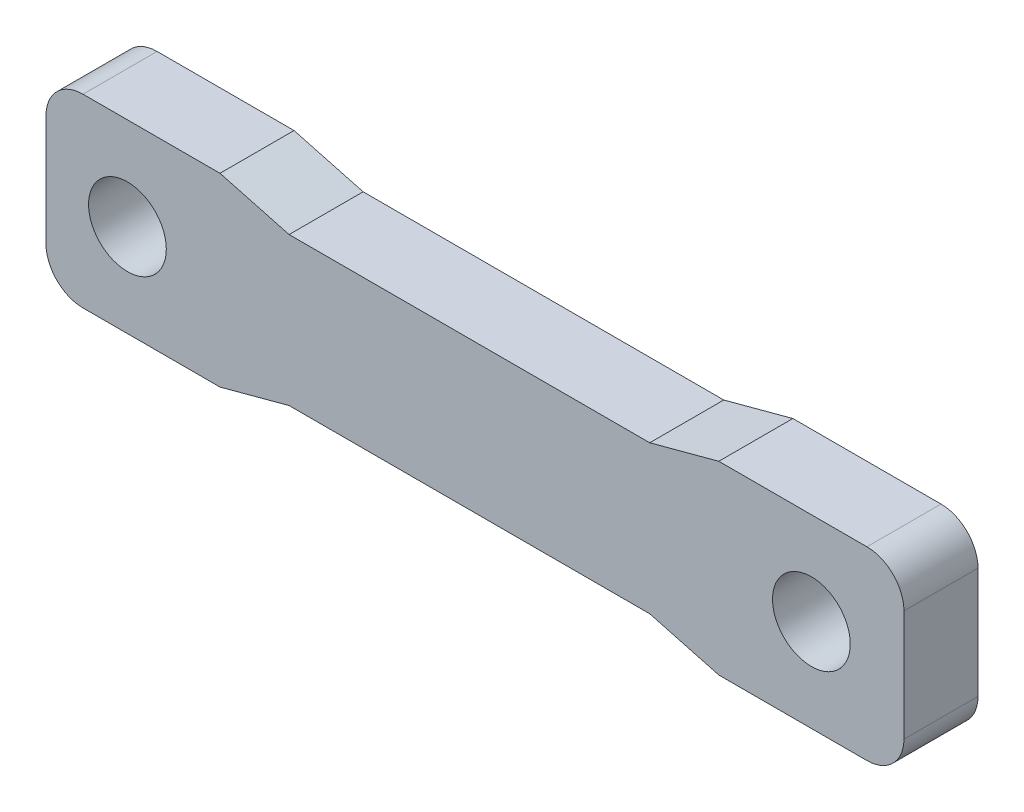
ISO-10303-21;
HEADER;
FILE_DESCRIPTION(('STEP AP214'),'2;1');
FILE_NAME('part.step','',(''),(''),'','','');
FILE_SCHEMA(('AUTOMOTIVE_DESIGN { 1 0 10303 214 1 1 1 1 }'));
ENDSEC;
DATA;
#1=APPLICATION_CONTEXT('core data for automotive mechanical design processes');
#2=APPLICATION_PROTOCOL_DEFINITION('international standard','automotive_design',2000,#1);
#3=PRODUCT_CONTEXT('',#1,'mechanical');
#4=PRODUCT('Part','Part','',(#3));
#5=PRODUCT_RELATED_PRODUCT_CATEGORY('part','',(#4));
#6=PRODUCT_DEFINITION_FORMATION('','',#4);
#7=PRODUCT_DEFINITION_CONTEXT('part definition',#1,'design');
#8=PRODUCT_DEFINITION('design','',#6,#7);
#9=PRODUCT_DEFINITION_SHAPE('','',#8);
#10=(LENGTH_UNIT() NAMED_UNIT(*) SI_UNIT(.MILLI.,.METRE.));
#11=(NAMED_UNIT(*) PLANE_ANGLE_UNIT() SI_UNIT($,.RADIAN.));
#12=(NAMED_UNIT(*) SI_UNIT($,.STERADIAN.) SOLID_ANGLE_UNIT());
#13=UNCERTAINTY_MEASURE_WITH_UNIT(LENGTH_MEASURE(1.E-05),#10,'distance_accuracy_value','');
#14=(GEOMETRIC_REPRESENTATION_CONTEXT(3) GLOBAL_UNCERTAINTY_ASSIGNED_CONTEXT((#13)) GLOBAL_UNIT_ASSIGNED_CONTEXT((#10,
#11,#12)) REPRESENTATION_CONTEXT('',''));
#15=CARTESIAN_POINT('',(0.,0.,0.));
#16=DIRECTION('',(0.,0.,1.));
#17=DIRECTION('',(1.,0.,0.));
#18=AXIS2_PLACEMENT_3D('',#15,#16,#17);
#19=CARTESIAN_POINT('',(-26.7785361810537,14.6,-4.5));
#20=DIRECTION('',(0.,0.,1.));
#21=DIRECTION('',(1.,0.,0.));
#22=AXIS2_PLACEMENT_3D('',#19,#20,#21);
#23=CYLINDRICAL_SURFACE('',#22,1.05);
#24=CARTESIAN_POINT('',(-26.7785361810537,14.6,0.));
#25=DIRECTION('',(0.,0.,1.));
#26=DIRECTION('',(1.,0.,0.));
#27=AXIS2_PLACEMENT_3D('',#24,#25,#26);
#28=CIRCLE('',#27,1.05);
#29=CARTESIAN_POINT('',(-25.7285361810537,14.6,0.));
#30=VERTEX_POINT('',#29);
#31=EDGE_CURVE('E383',#30,#30,#28,.F.);
#32=ORIENTED_EDGE('',*,*,#31,.T.);
#33=EDGE_LOOP('',(#32));
#34=FACE_BOUND('',#33,.T.);
#35=CARTESIAN_POINT('',(-26.7785361810537,14.6,2.));
#36=DIRECTION('',(0.,0.,1.));
#37=DIRECTION('',(1.,0.,0.));
#38=AXIS2_PLACEMENT_3D('',#35,#36,#37);
#39=CIRCLE('',#38,1.05);
#40=CARTESIAN_POINT('',(-25.7285361810537,14.6,2.));
#41=VERTEX_POINT('',#40);
#42=EDGE_CURVE('E322',#41,#41,#39,.T.);
#43=ORIENTED_EDGE('',*,*,#42,.T.);
#44=EDGE_LOOP('',(#43));
#45=FACE_BOUND('',#44,.T.);
#46=ADVANCED_FACE('F71',(#34,#45),#23,.F.);
#47=CARTESIAN_POINT('',(-53.25,12.1,-1.2));
#48=DIRECTION('',(0.,-1.,0.));
#49=DIRECTION('',(0.,0.,-1.));
#50=AXIS2_PLACEMENT_3D('',#47,#48,#49);
#51=PLANE('',#50);
#52=DIRECTION('',(1.,0.,0.));
#53=VECTOR('',#52,1.);
#54=CARTESIAN_POINT('',(-47.4492116240852,12.1,2.));
#55=LINE('',#54,#53);
#56=CARTESIAN_POINT('',(-46.4492116240852,12.1,2.));
#57=VERTEX_POINT('',#56);
#58=CARTESIAN_POINT('',(-42.75,12.1,2.));
#59=VERTEX_POINT('',#58);
#60=EDGE_CURVE('E391',#57,#59,#55,.T.);
#61=ORIENTED_EDGE('',*,*,#60,.F.);
#62=DIRECTION('',(0.,0.,-1.));
#63=VECTOR('',#62,1.);
#64=CARTESIAN_POINT('',(-46.4492116240852,12.1,0.));
#65=LINE('',#64,#63);
#66=CARTESIAN_POINT('',(-46.4492116240852,12.1,0.));
#67=VERTEX_POINT('',#66);
#68=EDGE_CURVE('E12',#57,#67,#65,.T.);
#69=ORIENTED_EDGE('',*,*,#68,.T.);
#70=DIRECTION('',(1.,0.,0.));
#71=VECTOR('',#70,1.);
#72=CARTESIAN_POINT('',(-47.4492116240852,12.1,0.));
#73=LINE('',#72,#71);
#74=CARTESIAN_POINT('',(-42.75,12.1,0.));
#75=VERTEX_POINT('',#74);
#76=EDGE_CURVE('E312',#67,#75,#73,.T.);
#77=ORIENTED_EDGE('',*,*,#76,.T.);
#78=DIRECTION('',(0.,0.,-1.));
#79=VECTOR('',#78,1.);
#80=CARTESIAN_POINT('',(-42.75,12.1,2.));
#81=LINE('',#80,#79);
#82=EDGE_CURVE('E240',#59,#75,#81,.T.);
#83=ORIENTED_EDGE('',*,*,#82,.F.);
#84=EDGE_LOOP('',(#61,#69,#77,#83));
#85=FACE_BOUND('',#84,.T.);
#86=ADVANCED_FACE('F417',(#85),#51,.T.);
#87=CARTESIAN_POINT('',(-53.25,17.1,-1.2));
#88=DIRECTION('',(0.,1.,0.));
#89=DIRECTION('',(0.,0.,1.));
#90=AXIS2_PLACEMENT_3D('',#87,#88,#89);
#91=PLANE('',#90);
#92=DIRECTION('',(1.,0.,0.));
#93=VECTOR('',#92,1.);
#94=CARTESIAN_POINT('',(-53.25,17.1,0.));
#95=LINE('',#94,#93);
#96=CARTESIAN_POINT('',(-46.4492116240852,17.1,0.));
#97=VERTEX_POINT('',#96);
#98=CARTESIAN_POINT('',(-42.75,17.1,0.));
#99=VERTEX_POINT('',#98);
#100=EDGE_CURVE('E194',#97,#99,#95,.T.);
#101=ORIENTED_EDGE('',*,*,#100,.F.);
#102=DIRECTION('',(0.,0.,-1.));
#103=VECTOR('',#102,1.);
#104=CARTESIAN_POINT('',(-46.4492116240852,17.1,2.));
#105=LINE('',#104,#103);
#106=CARTESIAN_POINT('',(-46.4492116240852,17.1,2.));
#107=VERTEX_POINT('',#106);
#108=EDGE_CURVE('E80',#97,#107,#105,.F.);
#109=ORIENTED_EDGE('',*,*,#108,.T.);
#110=DIRECTION('',(-1.,0.,0.));
#111=VECTOR('',#110,1.);
#112=CARTESIAN_POINT('',(-42.75,17.1,2.));
#113=LINE('',#112,#111);
#114=CARTESIAN_POINT('',(-42.75,17.1,2.));
#115=VERTEX_POINT('',#114);
#116=EDGE_CURVE('E200',#115,#107,#113,.T.);
#117=ORIENTED_EDGE('',*,*,#116,.F.);
#118=DIRECTION('',(0.,0.,-1.));
#119=VECTOR('',#118,1.);
#120=CARTESIAN_POINT('',(-42.75,17.1,2.));
#121=LINE('',#120,#119);
#122=EDGE_CURVE('E217',#115,#99,#121,.T.);
#123=ORIENTED_EDGE('',*,*,#122,.T.);
#124=EDGE_LOOP('',(#101,#109,#117,#123));
#125=FACE_BOUND('',#124,.T.);
#126=ADVANCED_FACE('F292',(#125),#91,.T.);
#127=CARTESIAN_POINT('',(-25.8038756778899,12.1,-3.));
#128=DIRECTION('',(0.,1.,0.));
#129=DIRECTION('',(0.,0.,1.));
#130=AXIS2_PLACEMENT_3D('',#127,#128,#129);
#131=PLANE('',#130);
#132=DIRECTION('',(1.,0.,0.));
#133=VECTOR('',#132,1.);
#134=CARTESIAN_POINT('',(-29.2785361810537,12.1,0.));
#135=LINE('',#134,#133);
#136=CARTESIAN_POINT('',(-29.2785361810537,12.1,0.));
#137=VERTEX_POINT('',#136);
#138=CARTESIAN_POINT('',(-25.2785361810537,12.1,0.));
#139=VERTEX_POINT('',#138);
#140=EDGE_CURVE('E338',#137,#139,#135,.T.);
#141=ORIENTED_EDGE('',*,*,#140,.T.);
#142=DIRECTION('',(0.,0.,-1.));
#143=VECTOR('',#142,1.);
#144=CARTESIAN_POINT('',(-25.2785361810537,12.1,-3.));
#145=LINE('',#144,#143);
#146=CARTESIAN_POINT('',(-25.2785361810537,12.1,2.));
#147=VERTEX_POINT('',#146);
#148=EDGE_CURVE('E263',#139,#147,#145,.F.);
#149=ORIENTED_EDGE('',*,*,#148,.T.);
#150=DIRECTION('',(1.,0.,0.));
#151=VECTOR('',#150,1.);
#152=CARTESIAN_POINT('',(-29.2785361810537,12.1,2.));
#153=LINE('',#152,#151);
#154=CARTESIAN_POINT('',(-29.2785361810537,12.1,2.));
#155=VERTEX_POINT('',#154);
#156=EDGE_CURVE('E369',#155,#147,#153,.T.);
#157=ORIENTED_EDGE('',*,*,#156,.F.);
#158=DIRECTION('',(0.,0.,-1.));
#159=VECTOR('',#158,1.);
#160=CARTESIAN_POINT('',(-29.2785361810537,12.1,2.));
#161=LINE('',#160,#159);
#162=EDGE_CURVE('E229',#155,#137,#161,.T.);
#163=ORIENTED_EDGE('',*,*,#162,.T.);
#164=EDGE_LOOP('',(#141,#149,#157,#163));
#165=FACE_BOUND('',#164,.T.);
#166=ADVANCED_FACE('F406',(#165),#131,.F.);
#167=CARTESIAN_POINT('',(-45.25,14.6,-4.5));
#168=DIRECTION('',(0.,0.,1.));
#169=DIRECTION('',(1.,0.,0.));
#170=AXIS2_PLACEMENT_3D('',#167,#168,#169);
#171=CYLINDRICAL_SURFACE('',#170,1.05);
#172=CARTESIAN_POINT('',(-45.25,14.6,0.));
#173=DIRECTION('',(0.,0.,1.));
#174=DIRECTION('',(1.,0.,0.));
#175=AXIS2_PLACEMENT_3D('',#172,#173,#174);
#176=CIRCLE('',#175,1.05);
#177=CARTESIAN_POINT('',(-44.2,14.6,0.));
#178=VERTEX_POINT('',#177);
#179=EDGE_CURVE('E425',#178,#178,#176,.F.);
#180=ORIENTED_EDGE('',*,*,#179,.T.);
#181=EDGE_LOOP('',(#180));
#182=FACE_BOUND('',#181,.T.);
#183=CARTESIAN_POINT('',(-45.25,14.6,2.));
#184=DIRECTION('',(0.,0.,1.));
#185=DIRECTION('',(1.,0.,0.));
#186=AXIS2_PLACEMENT_3D('',#183,#184,#185);
#187=CIRCLE('',#186,1.05);
#188=CARTESIAN_POINT('',(-44.2,14.6,2.));
#189=VERTEX_POINT('',#188);
#190=EDGE_CURVE('E313',#189,#189,#187,.T.);
#191=ORIENTED_EDGE('',*,*,#190,.T.);
#192=EDGE_LOOP('',(#191));
#193=FACE_BOUND('',#192,.T.);
#194=ADVANCED_FACE('F431',(#182,#193),#171,.F.);
#195=CARTESIAN_POINT('',(0.,0.,2.));
#196=DIRECTION('',(0.,0.,1.));
#197=DIRECTION('',(1.,0.,0.));
#198=AXIS2_PLACEMENT_3D('',#195,#196,#197);
#199=PLANE('',#198);
#200=ORIENTED_EDGE('',*,*,#190,.F.);
#201=EDGE_LOOP('',(#200));
#202=FACE_BOUND('',#201,.T.);
#203=ORIENTED_EDGE('',*,*,#156,.T.);
#204=CARTESIAN_POINT('',(-25.2785361810537,13.1,2.));
#205=DIRECTION('',(0.,0.,1.));
#206=DIRECTION('',(1.,0.,0.));
#207=AXIS2_PLACEMENT_3D('',#204,#205,#206);
#208=CIRCLE('',#207,1.);
#209=CARTESIAN_POINT('',(-24.2785361810537,13.1,2.));
#210=VERTEX_POINT('',#209);
#211=EDGE_CURVE('E273',#147,#210,#208,.T.);
#212=ORIENTED_EDGE('',*,*,#211,.T.);
#213=DIRECTION('',(0.,1.,0.));
#214=VECTOR('',#213,1.);
#215=CARTESIAN_POINT('',(-24.2785361810537,12.1,2.));
#216=LINE('',#215,#214);
#217=CARTESIAN_POINT('',(-24.2785361810537,16.1,2.));
#218=VERTEX_POINT('',#217);
#219=EDGE_CURVE('E366',#210,#218,#216,.T.);
#220=ORIENTED_EDGE('',*,*,#219,.T.);
#221=CARTESIAN_POINT('',(-25.2785361810537,16.1,2.));
#222=DIRECTION('',(0.,0.,1.));
#223=DIRECTION('',(1.,0.,0.));
#224=AXIS2_PLACEMENT_3D('',#221,#222,#223);
#225=CIRCLE('',#224,1.);
#226=CARTESIAN_POINT('',(-25.2785361810537,17.1,2.));
#227=VERTEX_POINT('',#226);
#228=EDGE_CURVE('E87',#218,#227,#225,.T.);
#229=ORIENTED_EDGE('',*,*,#228,.T.);
#230=DIRECTION('',(-1.,0.,0.));
#231=VECTOR('',#230,1.);
#232=CARTESIAN_POINT('',(-24.2785361810537,17.1,2.));
#233=LINE('',#232,#231);
#234=CARTESIAN_POINT('',(-29.2785361810537,17.1,2.));
#235=VERTEX_POINT('',#234);
#236=EDGE_CURVE('E359',#227,#235,#233,.T.);
#237=ORIENTED_EDGE('',*,*,#236,.T.);
#238=DIRECTION('',(-0.965925826289068,-0.258819045102523,0.));
#239=VECTOR('',#238,1.);
#240=CARTESIAN_POINT('',(-29.2785361810537,17.1,2.));
#241=LINE('',#240,#239);
#242=CARTESIAN_POINT('',(-31.1445615848381,16.6,2.));
#243=VERTEX_POINT('',#242);
#244=EDGE_CURVE('E371',#235,#243,#241,.T.);
#245=ORIENTED_EDGE('',*,*,#244,.T.);
#246=DIRECTION('',(-1.,0.,0.));
#247=VECTOR('',#246,1.);
#248=CARTESIAN_POINT('',(-40.8839745962156,16.6,2.));
#249=LINE('',#248,#247);
#250=CARTESIAN_POINT('',(-40.8839745962156,16.6,2.));
#251=VERTEX_POINT('',#250);
#252=EDGE_CURVE('E379',#243,#251,#249,.T.);
#253=ORIENTED_EDGE('',*,*,#252,.T.);
#254=DIRECTION('',(-0.965925826289068,0.258819045102523,0.));
#255=VECTOR('',#254,1.);
#256=CARTESIAN_POINT('',(-42.75,17.1,2.));
#257=LINE('',#256,#255);
#258=EDGE_CURVE('E215',#251,#115,#257,.T.);
#259=ORIENTED_EDGE('',*,*,#258,.T.);
#260=ORIENTED_EDGE('',*,*,#116,.T.);
#261=CARTESIAN_POINT('',(-46.4492116240852,16.1,2.));
#262=DIRECTION('',(0.,0.,1.));
#263=DIRECTION('',(1.,0.,0.));
#264=AXIS2_PLACEMENT_3D('',#261,#262,#263);
#265=CIRCLE('',#264,1.);
#266=CARTESIAN_POINT('',(-47.4492116240852,16.1,2.));
#267=VERTEX_POINT('',#266);
#268=EDGE_CURVE('E268',#107,#267,#265,.T.);
#269=ORIENTED_EDGE('',*,*,#268,.T.);
#270=DIRECTION('',(0.,-1.,0.));
#271=VECTOR('',#270,1.);
#272=CARTESIAN_POINT('',(-47.4492116240852,17.1,2.));
#273=LINE('',#272,#271);
#274=CARTESIAN_POINT('',(-47.4492116240852,13.1,2.));
#275=VERTEX_POINT('',#274);
#276=EDGE_CURVE('E300',#267,#275,#273,.T.);
#277=ORIENTED_EDGE('',*,*,#276,.T.);
#278=CARTESIAN_POINT('',(-46.4492116240852,13.1,2.));
#279=DIRECTION('',(0.,0.,1.));
#280=DIRECTION('',(1.,0.,0.));
#281=AXIS2_PLACEMENT_3D('',#278,#279,#280);
#282=CIRCLE('',#281,1.);
#283=EDGE_CURVE('E94',#275,#57,#282,.T.);
#284=ORIENTED_EDGE('',*,*,#283,.T.);
#285=ORIENTED_EDGE('',*,*,#60,.T.);
#286=DIRECTION('',(0.965925826289068,0.258819045102522,0.));
#287=VECTOR('',#286,1.);
#288=CARTESIAN_POINT('',(-42.75,12.1,2.));
#289=LINE('',#288,#287);
#290=CARTESIAN_POINT('',(-40.8839745962156,12.6,2.));
#291=VERTEX_POINT('',#290);
#292=EDGE_CURVE('E388',#59,#291,#289,.T.);
#293=ORIENTED_EDGE('',*,*,#292,.T.);
#294=DIRECTION('',(1.,0.,0.));
#295=VECTOR('',#294,1.);
#296=CARTESIAN_POINT('',(-40.8839745962156,12.6,2.));
#297=LINE('',#296,#295);
#298=CARTESIAN_POINT('',(-31.1445615848381,12.6,2.));
#299=VERTEX_POINT('',#298);
#300=EDGE_CURVE('E387',#291,#299,#297,.T.);
#301=ORIENTED_EDGE('',*,*,#300,.T.);
#302=DIRECTION('',(0.965925826289068,-0.258819045102521,0.));
#303=VECTOR('',#302,1.);
#304=CARTESIAN_POINT('',(-31.1445615848381,12.6,2.));
#305=LINE('',#304,#303);
#306=EDGE_CURVE('E374',#299,#155,#305,.T.);
#307=ORIENTED_EDGE('',*,*,#306,.T.);
#308=EDGE_LOOP('',(#203,#212,#220,#229,#237,#245,#253,#259,#260,#269,#277,#284,#285,#293,#301,#307));
#309=FACE_BOUND('',#308,.T.);
#310=ORIENTED_EDGE('',*,*,#42,.F.);
#311=EDGE_LOOP('',(#310));
#312=FACE_BOUND('',#311,.T.);
#313=ADVANCED_FACE('F296',(#202,#309,#312),#199,.T.);
#314=CARTESIAN_POINT('',(-47.4492116240852,17.1,2.));
#315=DIRECTION('',(1.,0.,0.));
#316=DIRECTION('',(0.,1.,0.));
#317=AXIS2_PLACEMENT_3D('',#314,#315,#316);
#318=PLANE('',#317);
#319=ORIENTED_EDGE('',*,*,#276,.F.);
#320=DIRECTION('',(0.,0.,-1.));
#321=VECTOR('',#320,1.);
#322=CARTESIAN_POINT('',(-47.4492116240852,16.1,0.));
#323=LINE('',#322,#321);
#324=CARTESIAN_POINT('',(-47.4492116240852,16.1,0.));
#325=VERTEX_POINT('',#324);
#326=EDGE_CURVE('E283',#267,#325,#323,.T.);
#327=ORIENTED_EDGE('',*,*,#326,.T.);
#328=DIRECTION('',(0.,-1.,0.));
#329=VECTOR('',#328,1.);
#330=CARTESIAN_POINT('',(-47.4492116240852,17.1,0.));
#331=LINE('',#330,#329);
#332=CARTESIAN_POINT('',(-47.4492116240852,13.1,0.));
#333=VERTEX_POINT('',#332);
#334=EDGE_CURVE('E308',#325,#333,#331,.T.);
#335=ORIENTED_EDGE('',*,*,#334,.T.);
#336=DIRECTION('',(0.,0.,-1.));
#337=VECTOR('',#336,1.);
#338=CARTESIAN_POINT('',(-47.4492116240852,13.1,2.));
#339=LINE('',#338,#337);
#340=EDGE_CURVE('E280',#333,#275,#339,.F.);
#341=ORIENTED_EDGE('',*,*,#340,.T.);
#342=EDGE_LOOP('',(#319,#327,#335,#341));
#343=FACE_BOUND('',#342,.T.);
#344=ADVANCED_FACE('F307',(#343),#318,.F.);
#345=CARTESIAN_POINT('',(-42.75,12.1,2.));
#346=DIRECTION('',(-0.258819045102522,0.965925826289068,0.));
#347=DIRECTION('',(-0.965925826289068,-0.258819045102522,0.));
#348=AXIS2_PLACEMENT_3D('',#345,#346,#347);
#349=PLANE('',#348);
#350=DIRECTION('',(0.965925826289068,0.258819045102522,0.));
#351=VECTOR('',#350,1.);
#352=CARTESIAN_POINT('',(-42.75,12.1,0.));
#353=LINE('',#352,#351);
#354=CARTESIAN_POINT('',(-40.8839745962156,12.6,0.));
#355=VERTEX_POINT('',#354);
#356=EDGE_CURVE('E318',#75,#355,#353,.T.);
#357=ORIENTED_EDGE('',*,*,#356,.T.);
#358=DIRECTION('',(0.,0.,-1.));
#359=VECTOR('',#358,1.);
#360=CARTESIAN_POINT('',(-40.8839745962156,12.6,2.));
#361=LINE('',#360,#359);
#362=EDGE_CURVE('E237',#291,#355,#361,.T.);
#363=ORIENTED_EDGE('',*,*,#362,.F.);
#364=ORIENTED_EDGE('',*,*,#292,.F.);
#365=ORIENTED_EDGE('',*,*,#82,.T.);
#366=EDGE_LOOP('',(#357,#363,#364,#365));
#367=FACE_BOUND('',#366,.T.);
#368=ADVANCED_FACE('F414',(#367),#349,.F.);
#369=CARTESIAN_POINT('',(-40.8839745962156,12.6,2.));
#370=DIRECTION('',(0.,1.,0.));
#371=DIRECTION('',(0.,0.,1.));
#372=AXIS2_PLACEMENT_3D('',#369,#370,#371);
#373=PLANE('',#372);
#374=DIRECTION('',(1.,0.,0.));
#375=VECTOR('',#374,1.);
#376=CARTESIAN_POINT('',(-40.8839745962156,12.6,0.));
#377=LINE('',#376,#375);
#378=CARTESIAN_POINT('',(-31.1445615848381,12.6,0.));
#379=VERTEX_POINT('',#378);
#380=EDGE_CURVE('E330',#355,#379,#377,.T.);
#381=ORIENTED_EDGE('',*,*,#380,.T.);
#382=DIRECTION('',(0.,0.,-1.));
#383=VECTOR('',#382,1.);
#384=CARTESIAN_POINT('',(-31.1445615848381,12.6,2.));
#385=LINE('',#384,#383);
#386=EDGE_CURVE('E233',#299,#379,#385,.T.);
#387=ORIENTED_EDGE('',*,*,#386,.F.);
#388=ORIENTED_EDGE('',*,*,#300,.F.);
#389=ORIENTED_EDGE('',*,*,#362,.T.);
#390=EDGE_LOOP('',(#381,#387,#388,#389));
#391=FACE_BOUND('',#390,.T.);
#392=ADVANCED_FACE('F412',(#391),#373,.F.);
#393=CARTESIAN_POINT('',(-31.1445615848381,12.6,2.));
#394=DIRECTION('',(0.25881904510252,0.965925826289068,0.));
#395=DIRECTION('',(-0.965925826289069,0.258819045102521,0.));
#396=AXIS2_PLACEMENT_3D('',#393,#394,#395);
#397=PLANE('',#396);
#398=DIRECTION('',(0.965925826289068,-0.258819045102521,0.));
#399=VECTOR('',#398,1.);
#400=CARTESIAN_POINT('',(-31.1445615848381,12.6,0.));
#401=LINE('',#400,#399);
#402=EDGE_CURVE('E334',#379,#137,#401,.T.);
#403=ORIENTED_EDGE('',*,*,#402,.T.);
#404=ORIENTED_EDGE('',*,*,#162,.F.);
#405=ORIENTED_EDGE('',*,*,#306,.F.);
#406=ORIENTED_EDGE('',*,*,#386,.T.);
#407=EDGE_LOOP('',(#403,#404,#405,#406));
#408=FACE_BOUND('',#407,.T.);
#409=ADVANCED_FACE('F404',(#408),#397,.F.);
#410=CARTESIAN_POINT('',(-24.2785361810537,12.1,2.));
#411=DIRECTION('',(-1.,0.,0.));
#412=DIRECTION('',(0.,0.,1.));
#413=AXIS2_PLACEMENT_3D('',#410,#411,#412);
#414=PLANE('',#413);
#415=ORIENTED_EDGE('',*,*,#219,.F.);
#416=DIRECTION('',(0.,0.,-1.));
#417=VECTOR('',#416,1.);
#418=CARTESIAN_POINT('',(-24.2785361810537,13.1,2.));
#419=LINE('',#418,#417);
#420=CARTESIAN_POINT('',(-24.2785361810537,13.1,0.));
#421=VERTEX_POINT('',#420);
#422=EDGE_CURVE('E247',#210,#421,#419,.T.);
#423=ORIENTED_EDGE('',*,*,#422,.T.);
#424=DIRECTION('',(0.,1.,0.));
#425=VECTOR('',#424,1.);
#426=CARTESIAN_POINT('',(-24.2785361810537,12.1,0.));
#427=LINE('',#426,#425);
#428=CARTESIAN_POINT('',(-24.2785361810537,16.1,0.));
#429=VERTEX_POINT('',#428);
#430=EDGE_CURVE('E342',#421,#429,#427,.T.);
#431=ORIENTED_EDGE('',*,*,#430,.T.);
#432=DIRECTION('',(0.,0.,-1.));
#433=VECTOR('',#432,1.);
#434=CARTESIAN_POINT('',(-24.2785361810537,16.1,2.));
#435=LINE('',#434,#433);
#436=EDGE_CURVE('E244',#429,#218,#435,.F.);
#437=ORIENTED_EDGE('',*,*,#436,.T.);
#438=EDGE_LOOP('',(#415,#423,#431,#437));
#439=FACE_BOUND('',#438,.T.);
#440=ADVANCED_FACE('F365',(#439),#414,.F.);
#441=CARTESIAN_POINT('',(-24.2785361810537,17.1,2.));
#442=DIRECTION('',(0.,-1.,0.));
#443=DIRECTION('',(0.,0.,-1.));
#444=AXIS2_PLACEMENT_3D('',#441,#442,#443);
#445=PLANE('',#444);
#446=ORIENTED_EDGE('',*,*,#236,.F.);
#447=DIRECTION('',(0.,0.,-1.));
#448=VECTOR('',#447,1.);
#449=CARTESIAN_POINT('',(-25.2785361810537,17.1,2.));
#450=LINE('',#449,#448);
#451=CARTESIAN_POINT('',(-25.2785361810537,17.1,0.));
#452=VERTEX_POINT('',#451);
#453=EDGE_CURVE('E276',#227,#452,#450,.T.);
#454=ORIENTED_EDGE('',*,*,#453,.T.);
#455=DIRECTION('',(-1.,0.,0.));
#456=VECTOR('',#455,1.);
#457=CARTESIAN_POINT('',(-24.2785361810537,17.1,0.));
#458=LINE('',#457,#456);
#459=CARTESIAN_POINT('',(-29.2785361810537,17.1,0.));
#460=VERTEX_POINT('',#459);
#461=EDGE_CURVE('E346',#452,#460,#458,.T.);
#462=ORIENTED_EDGE('',*,*,#461,.T.);
#463=DIRECTION('',(0.,0.,-1.));
#464=VECTOR('',#463,1.);
#465=CARTESIAN_POINT('',(-29.2785361810537,17.1,2.));
#466=LINE('',#465,#464);
#467=EDGE_CURVE('E221',#235,#460,#466,.T.);
#468=ORIENTED_EDGE('',*,*,#467,.F.);
#469=EDGE_LOOP('',(#446,#454,#462,#468));
#470=FACE_BOUND('',#469,.T.);
#471=ADVANCED_FACE('F357',(#470),#445,.F.);
#472=CARTESIAN_POINT('',(-29.2785361810537,17.1,2.));
#473=DIRECTION('',(0.258819045102523,-0.965925826289068,0.));
#474=DIRECTION('',(0.965925826289068,0.258819045102523,0.));
#475=AXIS2_PLACEMENT_3D('',#472,#473,#474);
#476=PLANE('',#475);
#477=DIRECTION('',(-0.965925826289068,-0.258819045102523,0.));
#478=VECTOR('',#477,1.);
#479=CARTESIAN_POINT('',(-29.2785361810537,17.1,0.));
#480=LINE('',#479,#478);
#481=CARTESIAN_POINT('',(-31.1445615848381,16.6,0.));
#482=VERTEX_POINT('',#481);
#483=EDGE_CURVE('E212',#460,#482,#480,.T.);
#484=ORIENTED_EDGE('',*,*,#483,.T.);
#485=DIRECTION('',(0.,0.,-1.));
#486=VECTOR('',#485,1.);
#487=CARTESIAN_POINT('',(-31.1445615848381,16.6,2.));
#488=LINE('',#487,#486);
#489=EDGE_CURVE('E210',#243,#482,#488,.T.);
#490=ORIENTED_EDGE('',*,*,#489,.F.);
#491=ORIENTED_EDGE('',*,*,#244,.F.);
#492=ORIENTED_EDGE('',*,*,#467,.T.);
#493=EDGE_LOOP('',(#484,#490,#491,#492));
#494=FACE_BOUND('',#493,.T.);
#495=ADVANCED_FACE('F352',(#494),#476,.F.);
#496=CARTESIAN_POINT('',(-40.8839745962156,16.6,2.));
#497=DIRECTION('',(0.,-1.,0.));
#498=DIRECTION('',(1.,0.,0.));
#499=AXIS2_PLACEMENT_3D('',#496,#497,#498);
#500=PLANE('',#499);
#501=DIRECTION('',(-1.,0.,0.));
#502=VECTOR('',#501,1.);
#503=CARTESIAN_POINT('',(-40.8839745962156,16.6,0.));
#504=LINE('',#503,#502);
#505=CARTESIAN_POINT('',(-40.8839745962156,16.6,0.));
#506=VERTEX_POINT('',#505);
#507=EDGE_CURVE('E191',#482,#506,#504,.T.);
#508=ORIENTED_EDGE('',*,*,#507,.T.);
#509=DIRECTION('',(0.,0.,-1.));
#510=VECTOR('',#509,1.);
#511=CARTESIAN_POINT('',(-40.8839745962156,16.6,2.));
#512=LINE('',#511,#510);
#513=EDGE_CURVE('E207',#251,#506,#512,.T.);
#514=ORIENTED_EDGE('',*,*,#513,.F.);
#515=ORIENTED_EDGE('',*,*,#252,.F.);
#516=ORIENTED_EDGE('',*,*,#489,.T.);
#517=EDGE_LOOP('',(#508,#514,#515,#516));
#518=FACE_BOUND('',#517,.T.);
#519=ADVANCED_FACE('F205',(#518),#500,.F.);
#520=CARTESIAN_POINT('',(-42.75,17.1,2.));
#521=DIRECTION('',(-0.258819045102523,-0.965925826289068,0.));
#522=DIRECTION('',(0.965925826289068,-0.258819045102523,0.));
#523=AXIS2_PLACEMENT_3D('',#520,#521,#522);
#524=PLANE('',#523);
#525=DIRECTION('',(-0.965925826289068,0.258819045102523,0.));
#526=VECTOR('',#525,1.);
#527=CARTESIAN_POINT('',(-42.75,17.1,0.));
#528=LINE('',#527,#526);
#529=EDGE_CURVE('E185',#506,#99,#528,.T.);
#530=ORIENTED_EDGE('',*,*,#529,.T.);
#531=ORIENTED_EDGE('',*,*,#122,.F.);
#532=ORIENTED_EDGE('',*,*,#258,.F.);
#533=ORIENTED_EDGE('',*,*,#513,.T.);
#534=EDGE_LOOP('',(#530,#531,#532,#533));
#535=FACE_BOUND('',#534,.T.);
#536=ADVANCED_FACE('F214',(#535),#524,.F.);
#537=CARTESIAN_POINT('',(0.,0.,0.));
#538=DIRECTION('',(0.,0.,1.));
#539=DIRECTION('',(1.,0.,0.));
#540=AXIS2_PLACEMENT_3D('',#537,#538,#539);
#541=PLANE('',#540);
#542=ORIENTED_EDGE('',*,*,#179,.F.);
#543=EDGE_LOOP('',(#542));
#544=FACE_BOUND('',#543,.T.);
#545=ORIENTED_EDGE('',*,*,#430,.F.);
#546=CARTESIAN_POINT('',(-25.2785361810537,13.1,0.));
#547=DIRECTION('',(0.,0.,1.));
#548=DIRECTION('',(1.,0.,0.));
#549=AXIS2_PLACEMENT_3D('',#546,#547,#548);
#550=CIRCLE('',#549,1.);
#551=EDGE_CURVE('E260',#421,#139,#550,.F.);
#552=ORIENTED_EDGE('',*,*,#551,.T.);
#553=ORIENTED_EDGE('',*,*,#140,.F.);
#554=ORIENTED_EDGE('',*,*,#402,.F.);
#555=ORIENTED_EDGE('',*,*,#380,.F.);
#556=ORIENTED_EDGE('',*,*,#356,.F.);
#557=ORIENTED_EDGE('',*,*,#76,.F.);
#558=CARTESIAN_POINT('',(-46.4492116240852,13.1,0.));
#559=DIRECTION('',(0.,0.,1.));
#560=DIRECTION('',(1.,0.,0.));
#561=AXIS2_PLACEMENT_3D('',#558,#559,#560);
#562=CIRCLE('',#561,1.);
#563=EDGE_CURVE('E251',#67,#333,#562,.F.);
#564=ORIENTED_EDGE('',*,*,#563,.T.);
#565=ORIENTED_EDGE('',*,*,#334,.F.);
#566=CARTESIAN_POINT('',(-46.4492116240852,16.1,0.));
#567=DIRECTION('',(0.,0.,1.));
#568=DIRECTION('',(1.,0.,0.));
#569=AXIS2_PLACEMENT_3D('',#566,#567,#568);
#570=CIRCLE('',#569,1.);
#571=EDGE_CURVE('E254',#325,#97,#570,.F.);
#572=ORIENTED_EDGE('',*,*,#571,.T.);
#573=ORIENTED_EDGE('',*,*,#100,.T.);
#574=ORIENTED_EDGE('',*,*,#529,.F.);
#575=ORIENTED_EDGE('',*,*,#507,.F.);
#576=ORIENTED_EDGE('',*,*,#483,.F.);
#577=ORIENTED_EDGE('',*,*,#461,.F.);
#578=CARTESIAN_POINT('',(-25.2785361810537,16.1,0.));
#579=DIRECTION('',(0.,0.,1.));
#580=DIRECTION('',(1.,0.,0.));
#581=AXIS2_PLACEMENT_3D('',#578,#579,#580);
#582=CIRCLE('',#581,1.);
#583=EDGE_CURVE('E257',#452,#429,#582,.F.);
#584=ORIENTED_EDGE('',*,*,#583,.T.);
#585=EDGE_LOOP('',(#545,#552,#553,#554,#555,#556,#557,#564,#565,#572,#573,#574,#575,#576,#577,#584));
#586=FACE_BOUND('',#585,.T.);
#587=ORIENTED_EDGE('',*,*,#31,.F.);
#588=EDGE_LOOP('',(#587));
#589=FACE_BOUND('',#588,.T.);
#590=ADVANCED_FACE('F188',(#544,#586,#589),#541,.F.);
#591=CARTESIAN_POINT('',(-25.2785361810537,13.1,2.));
#592=DIRECTION('',(0.,0.,-1.));
#593=DIRECTION('',(-1.,0.,0.));
#594=AXIS2_PLACEMENT_3D('',#591,#592,#593);
#595=CYLINDRICAL_SURFACE('',#594,1.);
#596=ORIENTED_EDGE('',*,*,#211,.F.);
#597=ORIENTED_EDGE('',*,*,#148,.F.);
#598=ORIENTED_EDGE('',*,*,#551,.F.);
#599=ORIENTED_EDGE('',*,*,#422,.F.);
#600=EDGE_LOOP('',(#596,#597,#598,#599));
#601=FACE_BOUND('',#600,.T.);
#602=ADVANCED_FACE('F409',(#601),#595,.T.);
#603=CARTESIAN_POINT('',(-25.2785361810537,16.1,2.));
#604=DIRECTION('',(0.,0.,-1.));
#605=DIRECTION('',(-1.,0.,0.));
#606=AXIS2_PLACEMENT_3D('',#603,#604,#605);
#607=CYLINDRICAL_SURFACE('',#606,1.);
#608=ORIENTED_EDGE('',*,*,#228,.F.);
#609=ORIENTED_EDGE('',*,*,#436,.F.);
#610=ORIENTED_EDGE('',*,*,#583,.F.);
#611=ORIENTED_EDGE('',*,*,#453,.F.);
#612=EDGE_LOOP('',(#608,#609,#610,#611));
#613=FACE_BOUND('',#612,.T.);
#614=ADVANCED_FACE('F361',(#613),#607,.T.);
#615=CARTESIAN_POINT('',(-46.4492116240852,16.1,2.));
#616=DIRECTION('',(0.,0.,1.));
#617=DIRECTION('',(1.,0.,0.));
#618=AXIS2_PLACEMENT_3D('',#615,#616,#617);
#619=CYLINDRICAL_SURFACE('',#618,1.);
#620=ORIENTED_EDGE('',*,*,#268,.F.);
#621=ORIENTED_EDGE('',*,*,#108,.F.);
#622=ORIENTED_EDGE('',*,*,#571,.F.);
#623=ORIENTED_EDGE('',*,*,#326,.F.);
#624=EDGE_LOOP('',(#620,#621,#622,#623));
#625=FACE_BOUND('',#624,.T.);
#626=ADVANCED_FACE('F303',(#625),#619,.T.);
#627=CARTESIAN_POINT('',(-46.4492116240852,13.1,-1.2));
#628=DIRECTION('',(0.,0.,1.));
#629=DIRECTION('',(1.,0.,0.));
#630=AXIS2_PLACEMENT_3D('',#627,#628,#629);
#631=CYLINDRICAL_SURFACE('',#630,1.);
#632=ORIENTED_EDGE('',*,*,#283,.F.);
#633=ORIENTED_EDGE('',*,*,#340,.F.);
#634=ORIENTED_EDGE('',*,*,#563,.F.);
#635=ORIENTED_EDGE('',*,*,#68,.F.);
#636=EDGE_LOOP('',(#632,#633,#634,#635));
#637=FACE_BOUND('',#636,.T.);
#638=ADVANCED_FACE('F73',(#637),#631,.T.);
#639=CLOSED_SHELL('',(#46,#86,#126,#166,#194,#313,#344,#368,#392,#409,#440,#471,#495,#519,#536,
#590,#602,#614,#626,#638));
#640=MANIFOLD_SOLID_BREP('B2',#639);
#641=ADVANCED_BREP_SHAPE_REPRESENTATION('',(#18,#640),#14);
#642=SHAPE_DEFINITION_REPRESENTATION(#9,#641);
ENDSEC;
END-ISO-10303-21;
